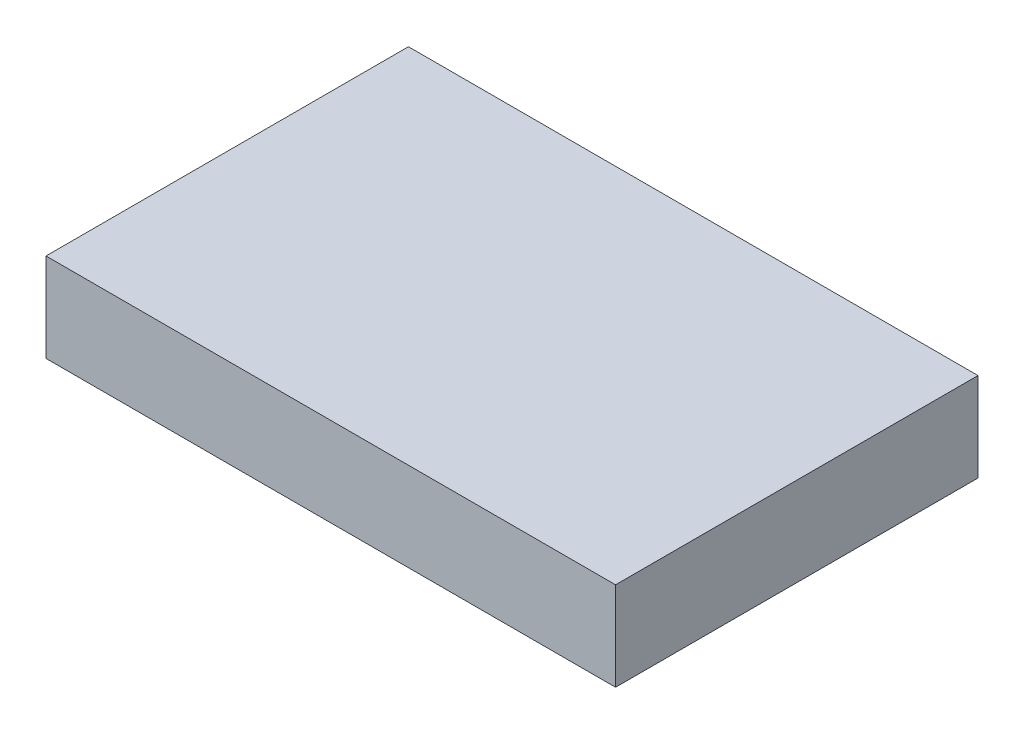
ISO-10303-21;
HEADER;
FILE_DESCRIPTION(('STEP AP214'),'2;1');
FILE_NAME('part.step','',(''),(''),'','','');
FILE_SCHEMA(('AUTOMOTIVE_DESIGN { 1 0 10303 214 1 1 1 1 }'));
ENDSEC;
DATA;
#1=APPLICATION_CONTEXT('core data for automotive mechanical design processes');
#2=APPLICATION_PROTOCOL_DEFINITION('international standard','automotive_design',2000,#1);
#3=PRODUCT_CONTEXT('',#1,'mechanical');
#4=PRODUCT('Part','Part','',(#3));
#5=PRODUCT_RELATED_PRODUCT_CATEGORY('part','',(#4));
#6=PRODUCT_DEFINITION_FORMATION('','',#4);
#7=PRODUCT_DEFINITION_CONTEXT('part definition',#1,'design');
#8=PRODUCT_DEFINITION('design','',#6,#7);
#9=PRODUCT_DEFINITION_SHAPE('','',#8);
#10=(LENGTH_UNIT() NAMED_UNIT(*) SI_UNIT(.MILLI.,.METRE.));
#11=(NAMED_UNIT(*) PLANE_ANGLE_UNIT() SI_UNIT($,.RADIAN.));
#12=(NAMED_UNIT(*) SI_UNIT($,.STERADIAN.) SOLID_ANGLE_UNIT());
#13=UNCERTAINTY_MEASURE_WITH_UNIT(LENGTH_MEASURE(1.E-05),#10,'distance_accuracy_value','');
#14=(GEOMETRIC_REPRESENTATION_CONTEXT(3) GLOBAL_UNCERTAINTY_ASSIGNED_CONTEXT((#13)) GLOBAL_UNIT_ASSIGNED_CONTEXT((#10,
#11,#12)) REPRESENTATION_CONTEXT('',''));
#15=CARTESIAN_POINT('',(0.,0.,0.));
#16=DIRECTION('',(0.,0.,1.));
#17=DIRECTION('',(1.,0.,0.));
#18=AXIS2_PLACEMENT_3D('',#15,#16,#17);
#19=CARTESIAN_POINT('',(38.5,12.,-24.5));
#20=DIRECTION('',(-1.,0.,0.));
#21=DIRECTION('',(0.,0.,1.));
#22=AXIS2_PLACEMENT_3D('',#19,#20,#21);
#23=PLANE('',#22);
#24=DIRECTION('',(0.,0.,-1.));
#25=VECTOR('',#24,1.);
#26=CARTESIAN_POINT('',(38.5,0.,-24.5));
#27=LINE('',#26,#25);
#28=CARTESIAN_POINT('',(38.5,0.,24.5));
#29=VERTEX_POINT('',#28);
#30=CARTESIAN_POINT('',(38.5,0.,-24.5));
#31=VERTEX_POINT('',#30);
#32=EDGE_CURVE('E96',#29,#31,#27,.T.);
#33=ORIENTED_EDGE('',*,*,#32,.T.);
#34=DIRECTION('',(0.,-1.,0.));
#35=VECTOR('',#34,1.);
#36=CARTESIAN_POINT('',(38.5,12.,-24.5));
#37=LINE('',#36,#35);
#38=CARTESIAN_POINT('',(38.5,12.,-24.5));
#39=VERTEX_POINT('',#38);
#40=EDGE_CURVE('E11',#39,#31,#37,.T.);
#41=ORIENTED_EDGE('',*,*,#40,.F.);
#42=DIRECTION('',(0.,0.,-1.));
#43=VECTOR('',#42,1.);
#44=CARTESIAN_POINT('',(38.5,12.,-24.5));
#45=LINE('',#44,#43);
#46=CARTESIAN_POINT('',(38.5,12.,24.5));
#47=VERTEX_POINT('',#46);
#48=EDGE_CURVE('E84',#47,#39,#45,.T.);
#49=ORIENTED_EDGE('',*,*,#48,.F.);
#50=DIRECTION('',(0.,-1.,0.));
#51=VECTOR('',#50,1.);
#52=CARTESIAN_POINT('',(38.5,12.,24.5));
#53=LINE('',#52,#51);
#54=EDGE_CURVE('E92',#47,#29,#53,.T.);
#55=ORIENTED_EDGE('',*,*,#54,.T.);
#56=EDGE_LOOP('',(#33,#41,#49,#55));
#57=FACE_BOUND('',#56,.T.);
#58=ADVANCED_FACE('F33',(#57),#23,.F.);
#59=CARTESIAN_POINT('',(-38.5,12.,-24.5));
#60=DIRECTION('',(0.,0.,1.));
#61=DIRECTION('',(1.,0.,0.));
#62=AXIS2_PLACEMENT_3D('',#59,#60,#61);
#63=PLANE('',#62);
#64=DIRECTION('',(-1.,0.,0.));
#65=VECTOR('',#64,1.);
#66=CARTESIAN_POINT('',(-38.5,0.,-24.5));
#67=LINE('',#66,#65);
#68=CARTESIAN_POINT('',(-38.5,0.,-24.5));
#69=VERTEX_POINT('',#68);
#70=EDGE_CURVE('E88',#31,#69,#67,.T.);
#71=ORIENTED_EDGE('',*,*,#70,.T.);
#72=DIRECTION('',(0.,-1.,0.));
#73=VECTOR('',#72,1.);
#74=CARTESIAN_POINT('',(-38.5,12.,-24.5));
#75=LINE('',#74,#73);
#76=CARTESIAN_POINT('',(-38.5,12.,-24.5));
#77=VERTEX_POINT('',#76);
#78=EDGE_CURVE('E41',#77,#69,#75,.T.);
#79=ORIENTED_EDGE('',*,*,#78,.F.);
#80=DIRECTION('',(-1.,0.,0.));
#81=VECTOR('',#80,1.);
#82=CARTESIAN_POINT('',(-38.5,12.,-24.5));
#83=LINE('',#82,#81);
#84=EDGE_CURVE('E79',#39,#77,#83,.T.);
#85=ORIENTED_EDGE('',*,*,#84,.F.);
#86=ORIENTED_EDGE('',*,*,#40,.T.);
#87=EDGE_LOOP('',(#71,#79,#85,#86));
#88=FACE_BOUND('',#87,.T.);
#89=ADVANCED_FACE('F87',(#88),#63,.F.);
#90=CARTESIAN_POINT('',(-38.5,12.,-24.5));
#91=DIRECTION('',(1.,0.,0.));
#92=DIRECTION('',(0.,0.,-1.));
#93=AXIS2_PLACEMENT_3D('',#90,#91,#92);
#94=PLANE('',#93);
#95=DIRECTION('',(0.,0.,1.));
#96=VECTOR('',#95,1.);
#97=CARTESIAN_POINT('',(-38.5,0.,-24.5));
#98=LINE('',#97,#96);
#99=CARTESIAN_POINT('',(-38.5,0.,24.5));
#100=VERTEX_POINT('',#99);
#101=EDGE_CURVE('E66',#69,#100,#98,.T.);
#102=ORIENTED_EDGE('',*,*,#101,.T.);
#103=DIRECTION('',(0.,-1.,0.));
#104=VECTOR('',#103,1.);
#105=CARTESIAN_POINT('',(-38.5,12.,24.5));
#106=LINE('',#105,#104);
#107=CARTESIAN_POINT('',(-38.5,12.,24.5));
#108=VERTEX_POINT('',#107);
#109=EDGE_CURVE('E89',#108,#100,#106,.T.);
#110=ORIENTED_EDGE('',*,*,#109,.F.);
#111=DIRECTION('',(0.,0.,1.));
#112=VECTOR('',#111,1.);
#113=CARTESIAN_POINT('',(-38.5,12.,-24.5));
#114=LINE('',#113,#112);
#115=EDGE_CURVE('E82',#77,#108,#114,.T.);
#116=ORIENTED_EDGE('',*,*,#115,.F.);
#117=ORIENTED_EDGE('',*,*,#78,.T.);
#118=EDGE_LOOP('',(#102,#110,#116,#117));
#119=FACE_BOUND('',#118,.T.);
#120=ADVANCED_FACE('F90',(#119),#94,.F.);
#121=CARTESIAN_POINT('',(-38.5,12.,24.5));
#122=DIRECTION('',(0.,0.,-1.));
#123=DIRECTION('',(-1.,0.,0.));
#124=AXIS2_PLACEMENT_3D('',#121,#122,#123);
#125=PLANE('',#124);
#126=DIRECTION('',(1.,0.,0.));
#127=VECTOR('',#126,1.);
#128=CARTESIAN_POINT('',(-38.5,0.,24.5));
#129=LINE('',#128,#127);
#130=EDGE_CURVE('E72',#100,#29,#129,.T.);
#131=ORIENTED_EDGE('',*,*,#130,.T.);
#132=ORIENTED_EDGE('',*,*,#54,.F.);
#133=DIRECTION('',(1.,0.,0.));
#134=VECTOR('',#133,1.);
#135=CARTESIAN_POINT('',(-38.5,12.,24.5));
#136=LINE('',#135,#134);
#137=EDGE_CURVE('E49',#108,#47,#136,.T.);
#138=ORIENTED_EDGE('',*,*,#137,.F.);
#139=ORIENTED_EDGE('',*,*,#109,.T.);
#140=EDGE_LOOP('',(#131,#132,#138,#139));
#141=FACE_BOUND('',#140,.T.);
#142=ADVANCED_FACE('F103',(#141),#125,.F.);
#143=CARTESIAN_POINT('',(0.,12.,0.));
#144=DIRECTION('',(0.,1.,0.));
#145=DIRECTION('',(0.,0.,1.));
#146=AXIS2_PLACEMENT_3D('',#143,#144,#145);
#147=PLANE('',#146);
#148=ORIENTED_EDGE('',*,*,#48,.T.);
#149=ORIENTED_EDGE('',*,*,#84,.T.);
#150=ORIENTED_EDGE('',*,*,#115,.T.);
#151=ORIENTED_EDGE('',*,*,#137,.T.);
#152=EDGE_LOOP('',(#148,#149,#150,#151));
#153=FACE_BOUND('',#152,.T.);
#154=ADVANCED_FACE('F80',(#153),#147,.T.);
#155=CARTESIAN_POINT('',(0.,0.,0.));
#156=DIRECTION('',(0.,1.,0.));
#157=DIRECTION('',(0.,0.,1.));
#158=AXIS2_PLACEMENT_3D('',#155,#156,#157);
#159=PLANE('',#158);
#160=ORIENTED_EDGE('',*,*,#32,.F.);
#161=ORIENTED_EDGE('',*,*,#130,.F.);
#162=ORIENTED_EDGE('',*,*,#101,.F.);
#163=ORIENTED_EDGE('',*,*,#70,.F.);
#164=EDGE_LOOP('',(#160,#161,#162,#163));
#165=FACE_BOUND('',#164,.T.);
#166=ADVANCED_FACE('F106',(#165),#159,.F.);
#167=CLOSED_SHELL('',(#58,#89,#120,#142,#154,#166));
#168=MANIFOLD_SOLID_BREP('B2',#167);
#169=ADVANCED_BREP_SHAPE_REPRESENTATION('',(#18,#168),#14);
#170=SHAPE_DEFINITION_REPRESENTATION(#9,#169);
ENDSEC;
END-ISO-10303-21;
